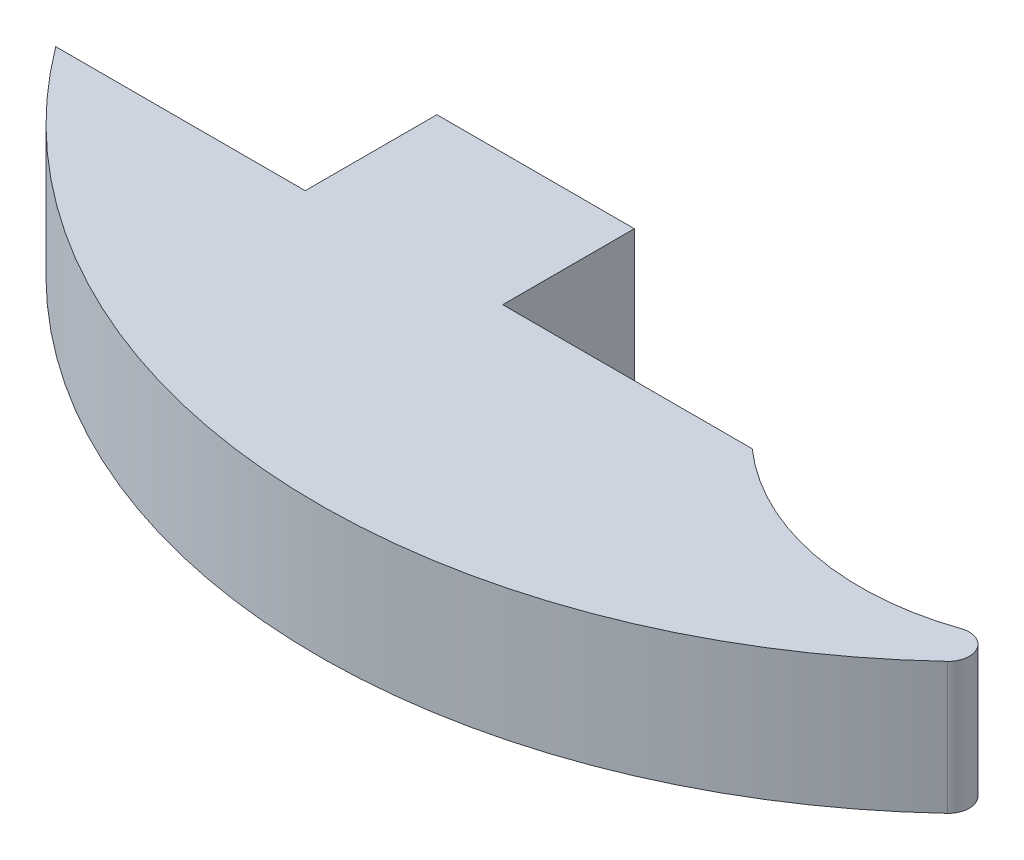
ISO-10303-21;
HEADER;
FILE_DESCRIPTION(('STEP AP214'),'2;1');
FILE_NAME('part.step','',(''),(''),'','','');
FILE_SCHEMA(('AUTOMOTIVE_DESIGN { 1 0 10303 214 1 1 1 1 }'));
ENDSEC;
DATA;
#1=APPLICATION_CONTEXT('core data for automotive mechanical design processes');
#2=APPLICATION_PROTOCOL_DEFINITION('international standard','automotive_design',2000,#1);
#3=PRODUCT_CONTEXT('',#1,'mechanical');
#4=PRODUCT('Part','Part','',(#3));
#5=PRODUCT_RELATED_PRODUCT_CATEGORY('part','',(#4));
#6=PRODUCT_DEFINITION_FORMATION('','',#4);
#7=PRODUCT_DEFINITION_CONTEXT('part definition',#1,'design');
#8=PRODUCT_DEFINITION('design','',#6,#7);
#9=PRODUCT_DEFINITION_SHAPE('','',#8);
#10=(LENGTH_UNIT() NAMED_UNIT(*) SI_UNIT(.MILLI.,.METRE.));
#11=(NAMED_UNIT(*) PLANE_ANGLE_UNIT() SI_UNIT($,.RADIAN.));
#12=(NAMED_UNIT(*) SI_UNIT($,.STERADIAN.) SOLID_ANGLE_UNIT());
#13=UNCERTAINTY_MEASURE_WITH_UNIT(LENGTH_MEASURE(1.E-05),#10,'distance_accuracy_value','');
#14=(GEOMETRIC_REPRESENTATION_CONTEXT(3) GLOBAL_UNCERTAINTY_ASSIGNED_CONTEXT((#13)) GLOBAL_UNIT_ASSIGNED_CONTEXT((#10,
#11,#12)) REPRESENTATION_CONTEXT('',''));
#15=CARTESIAN_POINT('',(0.,0.,0.));
#16=DIRECTION('',(0.,0.,1.));
#17=DIRECTION('',(1.,0.,0.));
#18=AXIS2_PLACEMENT_3D('',#15,#16,#17);
#19=CARTESIAN_POINT('',(-28.7484334819856,3.175,24.203082710305));
#20=DIRECTION('',(0.,-1.,0.));
#21=DIRECTION('',(0.,0.,-1.));
#22=AXIS2_PLACEMENT_3D('',#19,#20,#21);
#23=CYLINDRICAL_SURFACE('',#22,31.7500000000002);
#24=CARTESIAN_POINT('',(-28.7484334819856,-3.175,24.203082710305));
#25=DIRECTION('',(0.,1.,0.));
#26=DIRECTION('',(0.,0.,1.));
#27=AXIS2_PLACEMENT_3D('',#24,#25,#26);
#28=CIRCLE('',#27,31.7500000000002);
#29=CARTESIAN_POINT('',(-7.02382299467936,-3.175,47.3569981281093));
#30=VERTEX_POINT('',#29);
#31=CARTESIAN_POINT('',(-54.2024432577784,-3.175,43.1808561922985));
#32=VERTEX_POINT('',#31);
#33=EDGE_CURVE('E130',#30,#32,#28,.F.);
#34=ORIENTED_EDGE('',*,*,#33,.F.);
#35=DIRECTION('',(0.,1.,0.));
#36=VECTOR('',#35,1.);
#37=CARTESIAN_POINT('',(-7.02382299467936,-3.175,47.3569981281093));
#38=LINE('',#37,#36);
#39=CARTESIAN_POINT('',(-7.02382299467936,3.175,47.3569981281093));
#40=VERTEX_POINT('',#39);
#41=EDGE_CURVE('E50',#30,#40,#38,.T.);
#42=ORIENTED_EDGE('',*,*,#41,.T.);
#43=CARTESIAN_POINT('',(-28.7484334819856,3.175,24.203082710305));
#44=DIRECTION('',(0.,1.,0.));
#45=DIRECTION('',(0.,0.,1.));
#46=AXIS2_PLACEMENT_3D('',#43,#44,#45);
#47=CIRCLE('',#46,31.7500000000002);
#48=CARTESIAN_POINT('',(-54.2024432577784,3.175,43.1808561922985));
#49=VERTEX_POINT('',#48);
#50=EDGE_CURVE('E126',#40,#49,#47,.F.);
#51=ORIENTED_EDGE('',*,*,#50,.T.);
#52=DIRECTION('',(0.,-1.,0.));
#53=VECTOR('',#52,1.);
#54=CARTESIAN_POINT('',(-54.2024432577784,3.175,43.1808561922985));
#55=LINE('',#54,#53);
#56=EDGE_CURVE('E43',#49,#32,#55,.T.);
#57=ORIENTED_EDGE('',*,*,#56,.T.);
#58=EDGE_LOOP('',(#34,#42,#51,#57));
#59=FACE_BOUND('',#58,.T.);
#60=ADVANCED_FACE('F35',(#59),#23,.T.);
#61=CARTESIAN_POINT('',(0.,3.175,0.));
#62=DIRECTION('',(0.,1.,0.));
#63=DIRECTION('',(0.,0.,1.));
#64=AXIS2_PLACEMENT_3D('',#61,#62,#63);
#65=PLANE('',#64);
#66=ORIENTED_EDGE('',*,*,#50,.F.);
#67=CARTESIAN_POINT('',(-7.71901053027316,3.175,46.6160728347395));
#68=DIRECTION('',(0.,1.,0.));
#69=DIRECTION('',(0.,0.,1.));
#70=AXIS2_PLACEMENT_3D('',#67,#68,#69);
#71=CIRCLE('',#70,1.016);
#72=CARTESIAN_POINT('',(-8.05161418084442,3.175,45.6560567871515));
#73=VERTEX_POINT('',#72);
#74=EDGE_CURVE('E105',#40,#73,#71,.T.);
#75=ORIENTED_EDGE('',*,*,#74,.T.);
#76=CARTESIAN_POINT('',(-12.2091598129853,3.175,33.6558561923002));
#77=DIRECTION('',(0.,1.,0.));
#78=DIRECTION('',(0.,0.,1.));
#79=AXIS2_PLACEMENT_3D('',#76,#77,#78);
#80=CIRCLE('',#79,12.7);
#81=CARTESIAN_POINT('',(-20.6094202256172,3.175,43.1808561922985));
#82=VERTEX_POINT('',#81);
#83=EDGE_CURVE('E113',#82,#73,#80,.T.);
#84=ORIENTED_EDGE('',*,*,#83,.F.);
#85=DIRECTION('',(1.,0.,0.));
#86=VECTOR('',#85,1.);
#87=CARTESIAN_POINT('',(0.,3.175,43.1808561922985));
#88=LINE('',#87,#86);
#89=CARTESIAN_POINT('',(-32.6434317416977,3.175,43.1808561922985));
#90=VERTEX_POINT('',#89);
#91=EDGE_CURVE('E138',#90,#82,#88,.T.);
#92=ORIENTED_EDGE('',*,*,#91,.F.);
#93=DIRECTION('',(0.,0.,-1.));
#94=VECTOR('',#93,1.);
#95=CARTESIAN_POINT('',(-32.6434317416977,3.175,0.));
#96=LINE('',#95,#94);
#97=CARTESIAN_POINT('',(-32.6434317416977,3.175,36.8308561922998));
#98=VERTEX_POINT('',#97);
#99=EDGE_CURVE('E155',#90,#98,#96,.T.);
#100=ORIENTED_EDGE('',*,*,#99,.T.);
#101=DIRECTION('',(-1.,0.,0.));
#102=VECTOR('',#101,1.);
#103=CARTESIAN_POINT('',(0.,3.175,36.8308561922998));
#104=LINE('',#103,#102);
#105=CARTESIAN_POINT('',(-42.1684317416977,3.175,36.8308561922998));
#106=VERTEX_POINT('',#105);
#107=EDGE_CURVE('E151',#98,#106,#104,.T.);
#108=ORIENTED_EDGE('',*,*,#107,.T.);
#109=DIRECTION('',(0.,0.,-1.));
#110=VECTOR('',#109,1.);
#111=CARTESIAN_POINT('',(-42.1684317416977,3.175,0.));
#112=LINE('',#111,#110);
#113=CARTESIAN_POINT('',(-42.1684317416977,3.175,43.1808561922985));
#114=VERTEX_POINT('',#113);
#115=EDGE_CURVE('E114',#114,#106,#112,.T.);
#116=ORIENTED_EDGE('',*,*,#115,.F.);
#117=EDGE_CURVE('E135',#49,#114,#88,.T.);
#118=ORIENTED_EDGE('',*,*,#117,.F.);
#119=EDGE_LOOP('',(#66,#75,#84,#92,#100,#108,#116,#118));
#120=FACE_BOUND('',#119,.T.);
#121=ADVANCED_FACE('F166',(#120),#65,.T.);
#122=CARTESIAN_POINT('',(0.,-3.175,0.));
#123=DIRECTION('',(0.,1.,0.));
#124=DIRECTION('',(0.,0.,1.));
#125=AXIS2_PLACEMENT_3D('',#122,#123,#124);
#126=PLANE('',#125);
#127=CARTESIAN_POINT('',(-7.71901053027316,-3.175,46.6160728347395));
#128=DIRECTION('',(0.,1.,0.));
#129=DIRECTION('',(0.,0.,1.));
#130=AXIS2_PLACEMENT_3D('',#127,#128,#129);
#131=CIRCLE('',#130,1.016);
#132=CARTESIAN_POINT('',(-8.05161418084442,-3.175,45.6560567871515));
#133=VERTEX_POINT('',#132);
#134=EDGE_CURVE('E98',#30,#133,#131,.T.);
#135=ORIENTED_EDGE('',*,*,#134,.F.);
#136=ORIENTED_EDGE('',*,*,#33,.T.);
#137=DIRECTION('',(1.,0.,0.));
#138=VECTOR('',#137,1.);
#139=CARTESIAN_POINT('',(0.,-3.175,43.1808561922985));
#140=LINE('',#139,#138);
#141=CARTESIAN_POINT('',(-42.1684317416977,-3.175,43.1808561922985));
#142=VERTEX_POINT('',#141);
#143=EDGE_CURVE('E121',#32,#142,#140,.T.);
#144=ORIENTED_EDGE('',*,*,#143,.T.);
#145=DIRECTION('',(0.,0.,-1.));
#146=VECTOR('',#145,1.);
#147=CARTESIAN_POINT('',(-42.1684317416977,-3.175,0.));
#148=LINE('',#147,#146);
#149=CARTESIAN_POINT('',(-42.1684317416977,-3.175,36.8308561922998));
#150=VERTEX_POINT('',#149);
#151=EDGE_CURVE('E154',#142,#150,#148,.T.);
#152=ORIENTED_EDGE('',*,*,#151,.T.);
#153=DIRECTION('',(-1.,0.,0.));
#154=VECTOR('',#153,1.);
#155=CARTESIAN_POINT('',(0.,-3.175,36.8308561922998));
#156=LINE('',#155,#154);
#157=CARTESIAN_POINT('',(-32.6434317416977,-3.175,36.8308561922998));
#158=VERTEX_POINT('',#157);
#159=EDGE_CURVE('E147',#158,#150,#156,.T.);
#160=ORIENTED_EDGE('',*,*,#159,.F.);
#161=DIRECTION('',(0.,0.,-1.));
#162=VECTOR('',#161,1.);
#163=CARTESIAN_POINT('',(-32.6434317416977,-3.175,0.));
#164=LINE('',#163,#162);
#165=CARTESIAN_POINT('',(-32.6434317416977,-3.175,43.1808561922985));
#166=VERTEX_POINT('',#165);
#167=EDGE_CURVE('E58',#166,#158,#164,.T.);
#168=ORIENTED_EDGE('',*,*,#167,.F.);
#169=CARTESIAN_POINT('',(-20.6094202256172,-3.175,43.1808561922985));
#170=VERTEX_POINT('',#169);
#171=EDGE_CURVE('E118',#166,#170,#140,.T.);
#172=ORIENTED_EDGE('',*,*,#171,.T.);
#173=CARTESIAN_POINT('',(-12.2091598129853,-3.175,33.6558561923002));
#174=DIRECTION('',(0.,1.,0.));
#175=DIRECTION('',(0.,0.,1.));
#176=AXIS2_PLACEMENT_3D('',#173,#174,#175);
#177=CIRCLE('',#176,12.7);
#178=EDGE_CURVE('E111',#170,#133,#177,.T.);
#179=ORIENTED_EDGE('',*,*,#178,.T.);
#180=EDGE_LOOP('',(#135,#136,#144,#152,#160,#168,#172,#179));
#181=FACE_BOUND('',#180,.T.);
#182=ADVANCED_FACE('F116',(#181),#126,.F.);
#183=CARTESIAN_POINT('',(0.,3.175,43.1808561922985));
#184=DIRECTION('',(0.,0.,-1.));
#185=DIRECTION('',(-1.,0.,0.));
#186=AXIS2_PLACEMENT_3D('',#183,#184,#185);
#187=PLANE('',#186);
#188=ORIENTED_EDGE('',*,*,#117,.T.);
#189=DIRECTION('',(0.,1.,0.));
#190=VECTOR('',#189,1.);
#191=CARTESIAN_POINT('',(-42.1684317416977,-3.175,43.1808561922985));
#192=LINE('',#191,#190);
#193=EDGE_CURVE('E144',#142,#114,#192,.T.);
#194=ORIENTED_EDGE('',*,*,#193,.F.);
#195=ORIENTED_EDGE('',*,*,#143,.F.);
#196=ORIENTED_EDGE('',*,*,#56,.F.);
#197=EDGE_LOOP('',(#188,#194,#195,#196));
#198=FACE_BOUND('',#197,.T.);
#199=ADVANCED_FACE('F169',(#198),#187,.T.);
#200=CARTESIAN_POINT('',(-12.2091598129853,3.175,33.6558561923002));
#201=DIRECTION('',(0.,-1.,0.));
#202=DIRECTION('',(0.,0.,-1.));
#203=AXIS2_PLACEMENT_3D('',#200,#201,#202);
#204=CYLINDRICAL_SURFACE('',#203,12.7);
#205=DIRECTION('',(0.,1.,0.));
#206=VECTOR('',#205,1.);
#207=CARTESIAN_POINT('',(-8.05161418084442,-3.175,45.6560567871515));
#208=LINE('',#207,#206);
#209=EDGE_CURVE('E101',#133,#73,#208,.T.);
#210=ORIENTED_EDGE('',*,*,#209,.F.);
#211=ORIENTED_EDGE('',*,*,#178,.F.);
#212=DIRECTION('',(0.,-1.,0.));
#213=VECTOR('',#212,1.);
#214=CARTESIAN_POINT('',(-20.6094202256172,3.175,43.1808561922985));
#215=LINE('',#214,#213);
#216=EDGE_CURVE('E11',#82,#170,#215,.T.);
#217=ORIENTED_EDGE('',*,*,#216,.F.);
#218=ORIENTED_EDGE('',*,*,#83,.T.);
#219=EDGE_LOOP('',(#210,#211,#217,#218));
#220=FACE_BOUND('',#219,.T.);
#221=ADVANCED_FACE('F37',(#220),#204,.F.);
#222=DIRECTION('',(0.,1.,0.));
#223=VECTOR('',#222,1.);
#224=CARTESIAN_POINT('',(-32.6434317416977,-3.175,43.1808561922985));
#225=LINE('',#224,#223);
#226=EDGE_CURVE('E146',#166,#90,#225,.T.);
#227=ORIENTED_EDGE('',*,*,#226,.T.);
#228=ORIENTED_EDGE('',*,*,#91,.T.);
#229=ORIENTED_EDGE('',*,*,#216,.T.);
#230=ORIENTED_EDGE('',*,*,#171,.F.);
#231=EDGE_LOOP('',(#227,#228,#229,#230));
#232=FACE_BOUND('',#231,.T.);
#233=ADVANCED_FACE('F179',(#232),#187,.T.);
#234=CARTESIAN_POINT('',(-42.1684317416977,-3.175,0.));
#235=DIRECTION('',(1.,0.,0.));
#236=DIRECTION('',(0.,0.,-1.));
#237=AXIS2_PLACEMENT_3D('',#234,#235,#236);
#238=PLANE('',#237);
#239=ORIENTED_EDGE('',*,*,#115,.T.);
#240=DIRECTION('',(0.,1.,0.));
#241=VECTOR('',#240,1.);
#242=CARTESIAN_POINT('',(-42.1684317416977,-3.175,36.8308561922998));
#243=LINE('',#242,#241);
#244=EDGE_CURVE('E119',#150,#106,#243,.T.);
#245=ORIENTED_EDGE('',*,*,#244,.F.);
#246=ORIENTED_EDGE('',*,*,#151,.F.);
#247=ORIENTED_EDGE('',*,*,#193,.T.);
#248=EDGE_LOOP('',(#239,#245,#246,#247));
#249=FACE_BOUND('',#248,.T.);
#250=ADVANCED_FACE('F172',(#249),#238,.F.);
#251=CARTESIAN_POINT('',(0.,-3.175,36.8308561922998));
#252=DIRECTION('',(0.,0.,-1.));
#253=DIRECTION('',(-1.,0.,0.));
#254=AXIS2_PLACEMENT_3D('',#251,#252,#253);
#255=PLANE('',#254);
#256=ORIENTED_EDGE('',*,*,#107,.F.);
#257=DIRECTION('',(0.,1.,0.));
#258=VECTOR('',#257,1.);
#259=CARTESIAN_POINT('',(-32.6434317416977,-3.175,36.8308561922998));
#260=LINE('',#259,#258);
#261=EDGE_CURVE('E123',#158,#98,#260,.T.);
#262=ORIENTED_EDGE('',*,*,#261,.F.);
#263=ORIENTED_EDGE('',*,*,#159,.T.);
#264=ORIENTED_EDGE('',*,*,#244,.T.);
#265=EDGE_LOOP('',(#256,#262,#263,#264));
#266=FACE_BOUND('',#265,.T.);
#267=ADVANCED_FACE('F175',(#266),#255,.T.);
#268=CARTESIAN_POINT('',(-32.6434317416977,-3.175,0.));
#269=DIRECTION('',(1.,0.,0.));
#270=DIRECTION('',(0.,0.,-1.));
#271=AXIS2_PLACEMENT_3D('',#268,#269,#270);
#272=PLANE('',#271);
#273=ORIENTED_EDGE('',*,*,#99,.F.);
#274=ORIENTED_EDGE('',*,*,#226,.F.);
#275=ORIENTED_EDGE('',*,*,#167,.T.);
#276=ORIENTED_EDGE('',*,*,#261,.T.);
#277=EDGE_LOOP('',(#273,#274,#275,#276));
#278=FACE_BOUND('',#277,.T.);
#279=ADVANCED_FACE('F177',(#278),#272,.T.);
#280=CARTESIAN_POINT('',(-7.71901053027316,-3.175,46.6160728347395));
#281=DIRECTION('',(0.,1.,0.));
#282=DIRECTION('',(0.,0.,1.));
#283=AXIS2_PLACEMENT_3D('',#280,#281,#282);
#284=CYLINDRICAL_SURFACE('',#283,1.016);
#285=ORIENTED_EDGE('',*,*,#74,.F.);
#286=ORIENTED_EDGE('',*,*,#41,.F.);
#287=ORIENTED_EDGE('',*,*,#134,.T.);
#288=ORIENTED_EDGE('',*,*,#209,.T.);
#289=EDGE_LOOP('',(#285,#286,#287,#288));
#290=FACE_BOUND('',#289,.T.);
#291=ADVANCED_FACE('F100',(#290),#284,.T.);
#292=CLOSED_SHELL('',(#60,#121,#182,#199,#221,#233,#250,#267,#279,#291));
#293=MANIFOLD_SOLID_BREP('B2',#292);
#294=ADVANCED_BREP_SHAPE_REPRESENTATION('',(#18,#293),#14);
#295=SHAPE_DEFINITION_REPRESENTATION(#9,#294);
ENDSEC;
END-ISO-10303-21;
